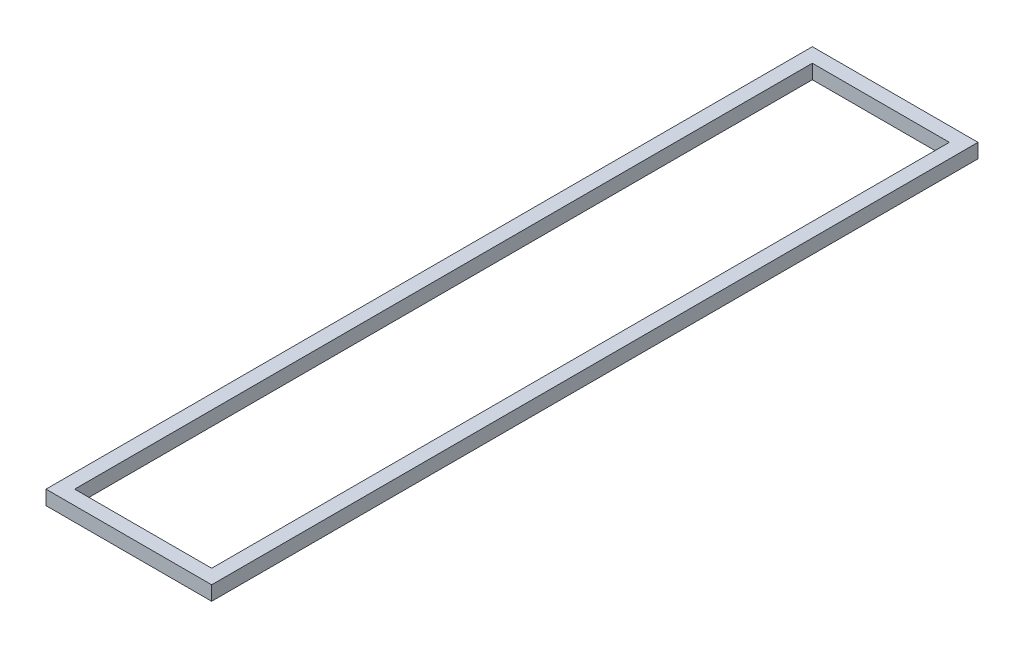
ISO-10303-21;
HEADER;
FILE_DESCRIPTION(('STEP AP214'),'2;1');
FILE_NAME('part.step','',(''),(''),'','','');
FILE_SCHEMA(('AUTOMOTIVE_DESIGN { 1 0 10303 214 1 1 1 1 }'));
ENDSEC;
DATA;
#1=APPLICATION_CONTEXT('core data for automotive mechanical design processes');
#2=APPLICATION_PROTOCOL_DEFINITION('international standard','automotive_design',2000,#1);
#3=PRODUCT_CONTEXT('',#1,'mechanical');
#4=PRODUCT('Part','Part','',(#3));
#5=PRODUCT_RELATED_PRODUCT_CATEGORY('part','',(#4));
#6=PRODUCT_DEFINITION_FORMATION('','',#4);
#7=PRODUCT_DEFINITION_CONTEXT('part definition',#1,'design');
#8=PRODUCT_DEFINITION('design','',#6,#7);
#9=PRODUCT_DEFINITION_SHAPE('','',#8);
#10=(LENGTH_UNIT() NAMED_UNIT(*) SI_UNIT(.MILLI.,.METRE.));
#11=(NAMED_UNIT(*) PLANE_ANGLE_UNIT() SI_UNIT($,.RADIAN.));
#12=(NAMED_UNIT(*) SI_UNIT($,.STERADIAN.) SOLID_ANGLE_UNIT());
#13=UNCERTAINTY_MEASURE_WITH_UNIT(LENGTH_MEASURE(1.E-05),#10,'distance_accuracy_value','');
#14=(GEOMETRIC_REPRESENTATION_CONTEXT(3) GLOBAL_UNCERTAINTY_ASSIGNED_CONTEXT((#13)) GLOBAL_UNIT_ASSIGNED_CONTEXT((#10,
#11,#12)) REPRESENTATION_CONTEXT('',''));
#15=CARTESIAN_POINT('',(0.,0.,0.));
#16=DIRECTION('',(0.,0.,1.));
#17=DIRECTION('',(1.,0.,0.));
#18=AXIS2_PLACEMENT_3D('',#15,#16,#17);
#19=CARTESIAN_POINT('',(-70.1988473005389,25.4,57.3933463750474));
#20=DIRECTION('',(0.,1.,0.));
#21=DIRECTION('',(0.,0.,1.));
#22=AXIS2_PLACEMENT_3D('',#19,#20,#21);
#23=PLANE('',#22);
#24=DIRECTION('',(0.,0.,1.));
#25=VECTOR('',#24,1.);
#26=CARTESIAN_POINT('',(-70.1988473005391,25.4,-1301.50665362495));
#27=LINE('',#26,#25);
#28=CARTESIAN_POINT('',(-70.1988473005391,25.4,-1301.50665362495));
#29=VERTEX_POINT('',#28);
#30=CARTESIAN_POINT('',(-70.1988473005389,25.4,57.3933463750474));
#31=VERTEX_POINT('',#30);
#32=EDGE_CURVE('E131',#29,#31,#27,.T.);
#33=ORIENTED_EDGE('',*,*,#32,.T.);
#34=DIRECTION('',(1.,0.,0.));
#35=VECTOR('',#34,1.);
#36=CARTESIAN_POINT('',(-70.1988473005389,25.4,57.3933463750474));
#37=LINE('',#36,#35);
#38=CARTESIAN_POINT('',(223.552152699461,25.4,57.3933463750473));
#39=VERTEX_POINT('',#38);
#40=EDGE_CURVE('E134',#31,#39,#37,.T.);
#41=ORIENTED_EDGE('',*,*,#40,.T.);
#42=DIRECTION('',(0.,0.,-1.));
#43=VECTOR('',#42,1.);
#44=CARTESIAN_POINT('',(223.552152699461,25.4,-1301.50665362495));
#45=LINE('',#44,#43);
#46=CARTESIAN_POINT('',(223.552152699461,25.4,-1301.50665362495));
#47=VERTEX_POINT('',#46);
#48=EDGE_CURVE('E137',#39,#47,#45,.T.);
#49=ORIENTED_EDGE('',*,*,#48,.T.);
#50=DIRECTION('',(-1.,0.,0.));
#51=VECTOR('',#50,1.);
#52=CARTESIAN_POINT('',(-70.1988473005391,25.4,-1301.50665362495));
#53=LINE('',#52,#51);
#54=EDGE_CURVE('E139',#47,#29,#53,.T.);
#55=ORIENTED_EDGE('',*,*,#54,.T.);
#56=EDGE_LOOP('',(#33,#41,#49,#55));
#57=FACE_BOUND('',#56,.T.);
#58=DIRECTION('',(1.,0.,0.));
#59=VECTOR('',#58,1.);
#60=CARTESIAN_POINT('',(-44.7988473005389,25.4,31.9933463750474));
#61=LINE('',#60,#59);
#62=CARTESIAN_POINT('',(-44.7988473005389,25.4,31.9933463750474));
#63=VERTEX_POINT('',#62);
#64=CARTESIAN_POINT('',(198.152152699461,25.4,31.9933463750474));
#65=VERTEX_POINT('',#64);
#66=EDGE_CURVE('E103',#63,#65,#61,.T.);
#67=ORIENTED_EDGE('',*,*,#66,.F.);
#68=DIRECTION('',(0.,0.,1.));
#69=VECTOR('',#68,1.);
#70=CARTESIAN_POINT('',(-44.7988473005391,25.4,-1276.10665362495));
#71=LINE('',#70,#69);
#72=CARTESIAN_POINT('',(-44.7988473005391,25.4,-1276.10665362495));
#73=VERTEX_POINT('',#72);
#74=EDGE_CURVE('E95',#73,#63,#71,.T.);
#75=ORIENTED_EDGE('',*,*,#74,.F.);
#76=DIRECTION('',(-1.,0.,0.));
#77=VECTOR('',#76,1.);
#78=CARTESIAN_POINT('',(-44.7988473005391,25.4,-1276.10665362495));
#79=LINE('',#78,#77);
#80=CARTESIAN_POINT('',(198.152152699461,25.4,-1276.10665362495));
#81=VERTEX_POINT('',#80);
#82=EDGE_CURVE('E117',#81,#73,#79,.T.);
#83=ORIENTED_EDGE('',*,*,#82,.F.);
#84=DIRECTION('',(0.,0.,-1.));
#85=VECTOR('',#84,1.);
#86=CARTESIAN_POINT('',(198.152152699461,25.4,-1276.10665362495));
#87=LINE('',#86,#85);
#88=EDGE_CURVE('E115',#65,#81,#87,.T.);
#89=ORIENTED_EDGE('',*,*,#88,.F.);
#90=EDGE_LOOP('',(#67,#75,#83,#89));
#91=FACE_BOUND('',#90,.T.);
#92=ADVANCED_FACE('F30',(#57,#91),#23,.T.);
#93=CARTESIAN_POINT('',(-70.1988473005389,0.,57.3933463750474));
#94=DIRECTION('',(0.,1.,0.));
#95=DIRECTION('',(0.,0.,1.));
#96=AXIS2_PLACEMENT_3D('',#93,#94,#95);
#97=PLANE('',#96);
#98=DIRECTION('',(0.,0.,1.));
#99=VECTOR('',#98,1.);
#100=CARTESIAN_POINT('',(-70.1988473005391,0.,-1301.50665362495));
#101=LINE('',#100,#99);
#102=CARTESIAN_POINT('',(-70.1988473005391,0.,-1301.50665362495));
#103=VERTEX_POINT('',#102);
#104=CARTESIAN_POINT('',(-70.1988473005389,0.,57.3933463750474));
#105=VERTEX_POINT('',#104);
#106=EDGE_CURVE('E111',#103,#105,#101,.T.);
#107=ORIENTED_EDGE('',*,*,#106,.F.);
#108=DIRECTION('',(-1.,0.,0.));
#109=VECTOR('',#108,1.);
#110=CARTESIAN_POINT('',(-70.1988473005391,0.,-1301.50665362495));
#111=LINE('',#110,#109);
#112=CARTESIAN_POINT('',(223.552152699461,0.,-1301.50665362495));
#113=VERTEX_POINT('',#112);
#114=EDGE_CURVE('E135',#113,#103,#111,.T.);
#115=ORIENTED_EDGE('',*,*,#114,.F.);
#116=DIRECTION('',(0.,0.,-1.));
#117=VECTOR('',#116,1.);
#118=CARTESIAN_POINT('',(223.552152699461,0.,-1301.50665362495));
#119=LINE('',#118,#117);
#120=CARTESIAN_POINT('',(223.552152699461,0.,57.3933463750473));
#121=VERTEX_POINT('',#120);
#122=EDGE_CURVE('E146',#121,#113,#119,.T.);
#123=ORIENTED_EDGE('',*,*,#122,.F.);
#124=DIRECTION('',(1.,0.,0.));
#125=VECTOR('',#124,1.);
#126=CARTESIAN_POINT('',(-70.1988473005389,0.,57.3933463750474));
#127=LINE('',#126,#125);
#128=EDGE_CURVE('E144',#105,#121,#127,.T.);
#129=ORIENTED_EDGE('',*,*,#128,.F.);
#130=EDGE_LOOP('',(#107,#115,#123,#129));
#131=FACE_BOUND('',#130,.T.);
#132=DIRECTION('',(0.,0.,1.));
#133=VECTOR('',#132,1.);
#134=CARTESIAN_POINT('',(-44.7988473005391,0.,-1276.10665362495));
#135=LINE('',#134,#133);
#136=CARTESIAN_POINT('',(-44.7988473005391,0.,-1276.10665362495));
#137=VERTEX_POINT('',#136);
#138=CARTESIAN_POINT('',(-44.7988473005389,0.,31.9933463750474));
#139=VERTEX_POINT('',#138);
#140=EDGE_CURVE('E53',#137,#139,#135,.T.);
#141=ORIENTED_EDGE('',*,*,#140,.T.);
#142=DIRECTION('',(1.,0.,0.));
#143=VECTOR('',#142,1.);
#144=CARTESIAN_POINT('',(-44.7988473005389,0.,31.9933463750474));
#145=LINE('',#144,#143);
#146=CARTESIAN_POINT('',(198.152152699461,0.,31.9933463750474));
#147=VERTEX_POINT('',#146);
#148=EDGE_CURVE('E110',#139,#147,#145,.T.);
#149=ORIENTED_EDGE('',*,*,#148,.T.);
#150=DIRECTION('',(0.,0.,-1.));
#151=VECTOR('',#150,1.);
#152=CARTESIAN_POINT('',(198.152152699461,0.,-1276.10665362495));
#153=LINE('',#152,#151);
#154=CARTESIAN_POINT('',(198.152152699461,0.,-1276.10665362495));
#155=VERTEX_POINT('',#154);
#156=EDGE_CURVE('E123',#147,#155,#153,.T.);
#157=ORIENTED_EDGE('',*,*,#156,.T.);
#158=DIRECTION('',(-1.,0.,0.));
#159=VECTOR('',#158,1.);
#160=CARTESIAN_POINT('',(-44.7988473005391,0.,-1276.10665362495));
#161=LINE('',#160,#159);
#162=EDGE_CURVE('E104',#155,#137,#161,.T.);
#163=ORIENTED_EDGE('',*,*,#162,.T.);
#164=EDGE_LOOP('',(#141,#149,#157,#163));
#165=FACE_BOUND('',#164,.T.);
#166=ADVANCED_FACE('F164',(#131,#165),#97,.F.);
#167=CARTESIAN_POINT('',(-70.1988473005391,25.4,-1301.50665362495));
#168=DIRECTION('',(1.,0.,0.));
#169=DIRECTION('',(0.,0.,-1.));
#170=AXIS2_PLACEMENT_3D('',#167,#168,#169);
#171=PLANE('',#170);
#172=ORIENTED_EDGE('',*,*,#106,.T.);
#173=DIRECTION('',(0.,-1.,0.));
#174=VECTOR('',#173,1.);
#175=CARTESIAN_POINT('',(-70.1988473005389,25.4,57.3933463750474));
#176=LINE('',#175,#174);
#177=EDGE_CURVE('E11',#31,#105,#176,.T.);
#178=ORIENTED_EDGE('',*,*,#177,.F.);
#179=ORIENTED_EDGE('',*,*,#32,.F.);
#180=DIRECTION('',(0.,-1.,0.));
#181=VECTOR('',#180,1.);
#182=CARTESIAN_POINT('',(-70.1988473005391,25.4,-1301.50665362495));
#183=LINE('',#182,#181);
#184=EDGE_CURVE('E141',#29,#103,#183,.T.);
#185=ORIENTED_EDGE('',*,*,#184,.T.);
#186=EDGE_LOOP('',(#172,#178,#179,#185));
#187=FACE_BOUND('',#186,.T.);
#188=ADVANCED_FACE('F32',(#187),#171,.F.);
#189=CARTESIAN_POINT('',(-70.1988473005389,25.4,57.3933463750474));
#190=DIRECTION('',(0.,0.,-1.));
#191=DIRECTION('',(-1.,0.,0.));
#192=AXIS2_PLACEMENT_3D('',#189,#190,#191);
#193=PLANE('',#192);
#194=ORIENTED_EDGE('',*,*,#128,.T.);
#195=DIRECTION('',(0.,-1.,0.));
#196=VECTOR('',#195,1.);
#197=CARTESIAN_POINT('',(223.552152699461,25.4,57.3933463750473));
#198=LINE('',#197,#196);
#199=EDGE_CURVE('E38',#39,#121,#198,.T.);
#200=ORIENTED_EDGE('',*,*,#199,.F.);
#201=ORIENTED_EDGE('',*,*,#40,.F.);
#202=ORIENTED_EDGE('',*,*,#177,.T.);
#203=EDGE_LOOP('',(#194,#200,#201,#202));
#204=FACE_BOUND('',#203,.T.);
#205=ADVANCED_FACE('F174',(#204),#193,.F.);
#206=CARTESIAN_POINT('',(223.552152699461,25.4,-1301.50665362495));
#207=DIRECTION('',(-1.,0.,0.));
#208=DIRECTION('',(0.,0.,1.));
#209=AXIS2_PLACEMENT_3D('',#206,#207,#208);
#210=PLANE('',#209);
#211=ORIENTED_EDGE('',*,*,#122,.T.);
#212=DIRECTION('',(0.,-1.,0.));
#213=VECTOR('',#212,1.);
#214=CARTESIAN_POINT('',(223.552152699461,25.4,-1301.50665362495));
#215=LINE('',#214,#213);
#216=EDGE_CURVE('E151',#47,#113,#215,.T.);
#217=ORIENTED_EDGE('',*,*,#216,.F.);
#218=ORIENTED_EDGE('',*,*,#48,.F.);
#219=ORIENTED_EDGE('',*,*,#199,.T.);
#220=EDGE_LOOP('',(#211,#217,#218,#219));
#221=FACE_BOUND('',#220,.T.);
#222=ADVANCED_FACE('F158',(#221),#210,.F.);
#223=CARTESIAN_POINT('',(-70.1988473005391,25.4,-1301.50665362495));
#224=DIRECTION('',(0.,0.,1.));
#225=DIRECTION('',(1.,0.,0.));
#226=AXIS2_PLACEMENT_3D('',#223,#224,#225);
#227=PLANE('',#226);
#228=ORIENTED_EDGE('',*,*,#114,.T.);
#229=ORIENTED_EDGE('',*,*,#184,.F.);
#230=ORIENTED_EDGE('',*,*,#54,.F.);
#231=ORIENTED_EDGE('',*,*,#216,.T.);
#232=EDGE_LOOP('',(#228,#229,#230,#231));
#233=FACE_BOUND('',#232,.T.);
#234=ADVANCED_FACE('F168',(#233),#227,.F.);
#235=CARTESIAN_POINT('',(-44.7988473005391,25.4,-1276.10665362495));
#236=DIRECTION('',(1.,0.,0.));
#237=DIRECTION('',(0.,0.,-1.));
#238=AXIS2_PLACEMENT_3D('',#235,#236,#237);
#239=PLANE('',#238);
#240=ORIENTED_EDGE('',*,*,#140,.F.);
#241=DIRECTION('',(0.,-1.,0.));
#242=VECTOR('',#241,1.);
#243=CARTESIAN_POINT('',(-44.7988473005391,25.4,-1276.10665362495));
#244=LINE('',#243,#242);
#245=EDGE_CURVE('E99',#73,#137,#244,.T.);
#246=ORIENTED_EDGE('',*,*,#245,.F.);
#247=ORIENTED_EDGE('',*,*,#74,.T.);
#248=DIRECTION('',(0.,-1.,0.));
#249=VECTOR('',#248,1.);
#250=CARTESIAN_POINT('',(-44.7988473005389,25.4,31.9933463750474));
#251=LINE('',#250,#249);
#252=EDGE_CURVE('E98',#63,#139,#251,.T.);
#253=ORIENTED_EDGE('',*,*,#252,.T.);
#254=EDGE_LOOP('',(#240,#246,#247,#253));
#255=FACE_BOUND('',#254,.T.);
#256=ADVANCED_FACE('F97',(#255),#239,.T.);
#257=CARTESIAN_POINT('',(-44.7988473005389,25.4,31.9933463750474));
#258=DIRECTION('',(0.,0.,-1.));
#259=DIRECTION('',(-1.,0.,0.));
#260=AXIS2_PLACEMENT_3D('',#257,#258,#259);
#261=PLANE('',#260);
#262=ORIENTED_EDGE('',*,*,#148,.F.);
#263=ORIENTED_EDGE('',*,*,#252,.F.);
#264=ORIENTED_EDGE('',*,*,#66,.T.);
#265=DIRECTION('',(0.,-1.,0.));
#266=VECTOR('',#265,1.);
#267=CARTESIAN_POINT('',(198.152152699461,25.4,31.9933463750474));
#268=LINE('',#267,#266);
#269=EDGE_CURVE('E112',#65,#147,#268,.T.);
#270=ORIENTED_EDGE('',*,*,#269,.T.);
#271=EDGE_LOOP('',(#262,#263,#264,#270));
#272=FACE_BOUND('',#271,.T.);
#273=ADVANCED_FACE('F107',(#272),#261,.T.);
#274=CARTESIAN_POINT('',(198.152152699461,25.4,-1276.10665362495));
#275=DIRECTION('',(-1.,0.,0.));
#276=DIRECTION('',(0.,0.,1.));
#277=AXIS2_PLACEMENT_3D('',#274,#275,#276);
#278=PLANE('',#277);
#279=ORIENTED_EDGE('',*,*,#156,.F.);
#280=ORIENTED_EDGE('',*,*,#269,.F.);
#281=ORIENTED_EDGE('',*,*,#88,.T.);
#282=DIRECTION('',(0.,-1.,0.));
#283=VECTOR('',#282,1.);
#284=CARTESIAN_POINT('',(198.152152699461,25.4,-1276.10665362495));
#285=LINE('',#284,#283);
#286=EDGE_CURVE('E45',#81,#155,#285,.T.);
#287=ORIENTED_EDGE('',*,*,#286,.T.);
#288=EDGE_LOOP('',(#279,#280,#281,#287));
#289=FACE_BOUND('',#288,.T.);
#290=ADVANCED_FACE('F197',(#289),#278,.T.);
#291=CARTESIAN_POINT('',(-44.7988473005391,25.4,-1276.10665362495));
#292=DIRECTION('',(0.,0.,1.));
#293=DIRECTION('',(1.,0.,0.));
#294=AXIS2_PLACEMENT_3D('',#291,#292,#293);
#295=PLANE('',#294);
#296=ORIENTED_EDGE('',*,*,#162,.F.);
#297=ORIENTED_EDGE('',*,*,#286,.F.);
#298=ORIENTED_EDGE('',*,*,#82,.T.);
#299=ORIENTED_EDGE('',*,*,#245,.T.);
#300=EDGE_LOOP('',(#296,#297,#298,#299));
#301=FACE_BOUND('',#300,.T.);
#302=ADVANCED_FACE('F201',(#301),#295,.T.);
#303=CLOSED_SHELL('',(#92,#166,#188,#205,#222,#234,#256,#273,#290,#302));
#304=MANIFOLD_SOLID_BREP('B2',#303);
#305=ADVANCED_BREP_SHAPE_REPRESENTATION('',(#18,#304),#14);
#306=SHAPE_DEFINITION_REPRESENTATION(#9,#305);
ENDSEC;
END-ISO-10303-21;
